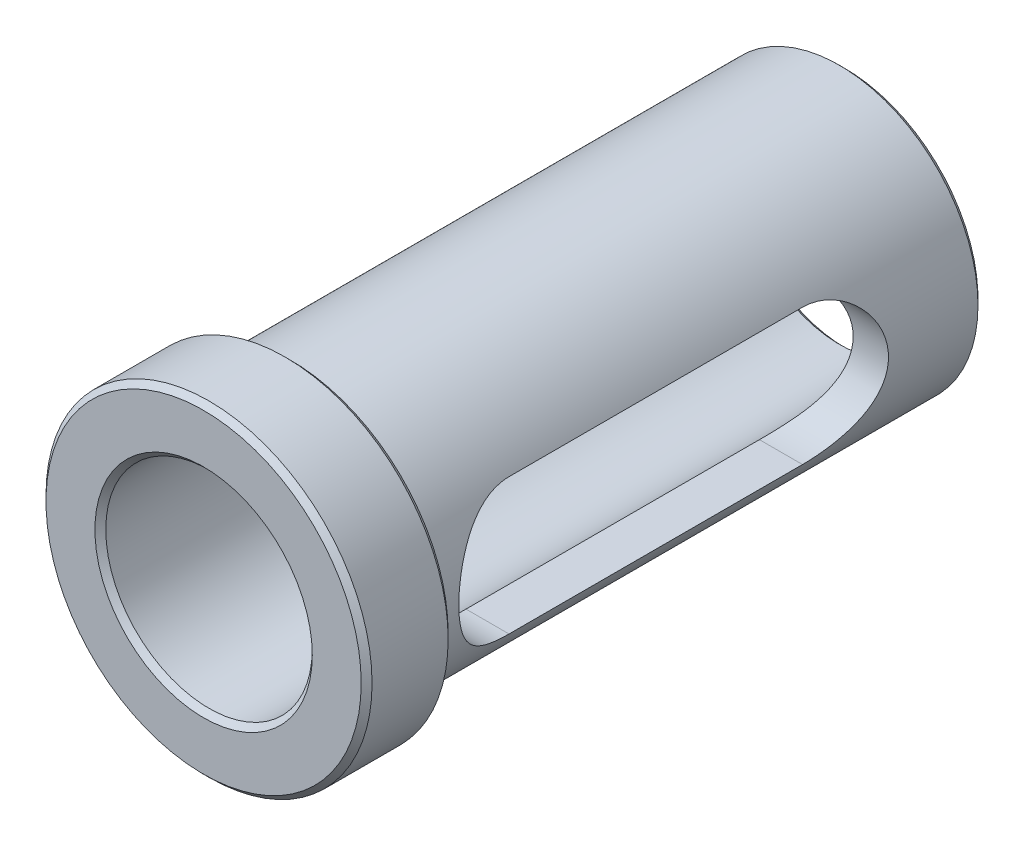
ISO-10303-21;
HEADER;
FILE_DESCRIPTION(('STEP AP214'),'2;1');
FILE_NAME('part.step','',(''),(''),'','','');
FILE_SCHEMA(('AUTOMOTIVE_DESIGN { 1 0 10303 214 1 1 1 1 }'));
ENDSEC;
DATA;
#1=APPLICATION_CONTEXT('core data for automotive mechanical design processes');
#2=APPLICATION_PROTOCOL_DEFINITION('international standard','automotive_design',2000,#1);
#3=PRODUCT_CONTEXT('',#1,'mechanical');
#4=PRODUCT('Part','Part','',(#3));
#5=PRODUCT_RELATED_PRODUCT_CATEGORY('part','',(#4));
#6=PRODUCT_DEFINITION_FORMATION('','',#4);
#7=PRODUCT_DEFINITION_CONTEXT('part definition',#1,'design');
#8=PRODUCT_DEFINITION('design','',#6,#7);
#9=PRODUCT_DEFINITION_SHAPE('','',#8);
#10=(LENGTH_UNIT() NAMED_UNIT(*) SI_UNIT(.MILLI.,.METRE.));
#11=(NAMED_UNIT(*) PLANE_ANGLE_UNIT() SI_UNIT($,.RADIAN.));
#12=(NAMED_UNIT(*) SI_UNIT($,.STERADIAN.) SOLID_ANGLE_UNIT());
#13=UNCERTAINTY_MEASURE_WITH_UNIT(LENGTH_MEASURE(1.E-05),#10,'distance_accuracy_value','');
#14=(GEOMETRIC_REPRESENTATION_CONTEXT(3) GLOBAL_UNCERTAINTY_ASSIGNED_CONTEXT((#13)) GLOBAL_UNIT_ASSIGNED_CONTEXT((#10,
#11,#12)) REPRESENTATION_CONTEXT('',''));
#15=CARTESIAN_POINT('',(0.,0.,0.));
#16=DIRECTION('',(0.,0.,1.));
#17=DIRECTION('',(1.,0.,0.));
#18=AXIS2_PLACEMENT_3D('',#15,#16,#17);
#19=CARTESIAN_POINT('',(-60.,30.,59.));
#20=DIRECTION('',(0.,0.,1.));
#21=DIRECTION('',(1.,0.,0.));
#22=AXIS2_PLACEMENT_3D('',#19,#20,#21);
#23=PLANE('',#22);
#24=CARTESIAN_POINT('',(-30.,0.,59.));
#25=DIRECTION('',(0.,0.,1.));
#26=DIRECTION('',(1.,0.,0.));
#27=AXIS2_PLACEMENT_3D('',#24,#25,#26);
#28=CIRCLE('',#27,29.);
#29=CARTESIAN_POINT('',(-1.,0.,59.));
#30=VERTEX_POINT('',#29);
#31=EDGE_CURVE('E84',#30,#30,#28,.T.);
#32=ORIENTED_EDGE('',*,*,#31,.T.);
#33=EDGE_LOOP('',(#32));
#34=FACE_BOUND('',#33,.T.);
#35=CARTESIAN_POINT('',(-30.,0.,59.));
#36=DIRECTION('',(0.,0.,1.));
#37=DIRECTION('',(1.,0.,0.));
#38=AXIS2_PLACEMENT_3D('',#35,#36,#37);
#39=CIRCLE('',#38,20.);
#40=CARTESIAN_POINT('',(-10.,0.,59.));
#41=VERTEX_POINT('',#40);
#42=EDGE_CURVE('E255',#41,#41,#39,.F.);
#43=ORIENTED_EDGE('',*,*,#42,.T.);
#44=EDGE_LOOP('',(#43));
#45=FACE_BOUND('',#44,.T.);
#46=ADVANCED_FACE('F75',(#34,#45),#23,.T.);
#47=CARTESIAN_POINT('',(0.,0.,43.));
#48=DIRECTION('',(0.,0.,1.));
#49=DIRECTION('',(1.,0.,0.));
#50=AXIS2_PLACEMENT_3D('',#47,#48,#49);
#51=PLANE('',#50);
#52=CARTESIAN_POINT('',(-30.,0.,43.));
#53=DIRECTION('',(0.,0.,1.));
#54=DIRECTION('',(1.,0.,0.));
#55=AXIS2_PLACEMENT_3D('',#52,#53,#54);
#56=CIRCLE('',#55,29.);
#57=CARTESIAN_POINT('',(-1.00000000000003,0.,43.));
#58=VERTEX_POINT('',#57);
#59=EDGE_CURVE('E256',#58,#58,#56,.F.);
#60=ORIENTED_EDGE('',*,*,#59,.T.);
#61=EDGE_LOOP('',(#60));
#62=FACE_BOUND('',#61,.T.);
#63=CARTESIAN_POINT('',(-30.,0.,43.));
#64=DIRECTION('',(0.,0.,-1.));
#65=DIRECTION('',(-1.,0.,0.));
#66=AXIS2_PLACEMENT_3D('',#63,#64,#65);
#67=CIRCLE('',#66,25.5);
#68=CARTESIAN_POINT('',(-55.5,0.,43.));
#69=VERTEX_POINT('',#68);
#70=EDGE_CURVE('E131',#69,#69,#67,.T.);
#71=ORIENTED_EDGE('',*,*,#70,.F.);
#72=EDGE_LOOP('',(#71));
#73=FACE_BOUND('',#72,.T.);
#74=ADVANCED_FACE('F191',(#62,#73),#51,.F.);
#75=CARTESIAN_POINT('',(-30.,0.,43.));
#76=DIRECTION('',(0.,0.,-1.));
#77=DIRECTION('',(-1.,0.,0.));
#78=AXIS2_PLACEMENT_3D('',#75,#76,#77);
#79=CYLINDRICAL_SURFACE('',#78,25.5);
#80=CARTESIAN_POINT('',(-30.,0.,-58.));
#81=DIRECTION('',(0.,0.,-1.));
#82=DIRECTION('',(-1.,0.,0.));
#83=AXIS2_PLACEMENT_3D('',#80,#81,#82);
#84=CIRCLE('',#83,25.5);
#85=CARTESIAN_POINT('',(-55.5,0.,-58.));
#86=VERTEX_POINT('',#85);
#87=EDGE_CURVE('E267',#86,#86,#84,.F.);
#88=ORIENTED_EDGE('',*,*,#87,.T.);
#89=EDGE_LOOP('',(#88));
#90=FACE_BOUND('',#89,.T.);
#91=ORIENTED_EDGE('',*,*,#70,.T.);
#92=EDGE_LOOP('',(#91));
#93=FACE_BOUND('',#92,.T.);
#94=CARTESIAN_POINT('',(-7.79306287389968,12.5340314136126,-29.));
#95=CARTESIAN_POINT('',(-7.79306652545145,12.534032584199,-29.1645527371761));
#96=CARTESIAN_POINT('',(-7.79123311705935,12.5307902200339,-29.3290823653121));
#97=CARTESIAN_POINT('',(-7.78392966300405,12.5178392432237,-29.6577995536914));
#98=CARTESIAN_POINT('',(-7.77845976488152,12.5081308929184,-29.8219871275416));
#99=CARTESIAN_POINT('',(-7.75666332184563,12.469359027442,-30.3133427365442));
#100=CARTESIAN_POINT('',(-7.73494990598311,12.4306486226182,-30.6395760527475));
#101=CARTESIAN_POINT('',(-7.67811970129288,12.3283020550073,-31.284979706198));
#102=CARTESIAN_POINT('',(-7.64307813610044,12.2648057311958,-31.6041792360231));
#103=CARTESIAN_POINT('',(-7.56081797273052,12.1136494364806,-32.2352297708415));
#104=CARTESIAN_POINT('',(-7.51359804339331,12.0259868240013,-32.5470799684445));
#105=CARTESIAN_POINT('',(-7.40865225416722,11.827660316394,-33.1607921363425));
#106=CARTESIAN_POINT('',(-7.35094855679309,11.7170448743736,-33.4626736189136));
#107=CARTESIAN_POINT('',(-7.22672427638553,11.4737333521897,-34.0554973795504));
#108=CARTESIAN_POINT('',(-7.16020379689223,11.341037531323,-34.346439786028));
#109=CARTESIAN_POINT('',(-7.02011702173395,11.0544307541191,-34.9163651202726));
#110=CARTESIAN_POINT('',(-6.94654212299853,10.9004937905381,-35.1953328289028));
#111=CARTESIAN_POINT('',(-6.79428746304174,10.5724927883026,-35.7398371087399));
#112=CARTESIAN_POINT('',(-6.71560582830033,10.3984213443365,-36.0053686862944));
#113=CARTESIAN_POINT('',(-6.5487212394416,10.0166986065193,-36.5421834481331));
#114=CARTESIAN_POINT('',(-6.46025637200227,9.8074825401531,-36.8122735959822));
#115=CARTESIAN_POINT('',(-6.28191992756092,9.36797310242462,-37.334232986258));
#116=CARTESIAN_POINT('',(-6.19204828084334,9.13767868372659,-37.5861013221695));
#117=CARTESIAN_POINT('',(-6.01310615228207,8.65706034895145,-38.0704848904219));
#118=CARTESIAN_POINT('',(-5.92403602234277,8.40672807102496,-38.3029919598095));
#119=CARTESIAN_POINT('',(-5.74893566361122,7.88739155364787,-38.7471901804871));
#120=CARTESIAN_POINT('',(-5.66290442058673,7.6183936344533,-38.9588883196505));
#121=CARTESIAN_POINT('',(-5.4904959916685,7.04482773820211,-39.3733080100405));
#122=CARTESIAN_POINT('',(-5.4044605086628,6.73908418558674,-39.5745492773418));
#123=CARTESIAN_POINT('',(-5.24056082045561,6.10949863103787,-39.9503593987374));
#124=CARTESIAN_POINT('',(-5.16269706729838,5.78565562939498,-40.1249267775271));
#125=CARTESIAN_POINT('',(-5.01741719504334,5.12209322769465,-40.4456024325304));
#126=CARTESIAN_POINT('',(-4.94999623444972,4.78238128046932,-40.5917239049775));
#127=CARTESIAN_POINT('',(-4.82758325896988,4.08939861262998,-40.8539429749819));
#128=CARTESIAN_POINT('',(-4.77258997446635,3.73612928136222,-40.970043639654));
#129=CARTESIAN_POINT('',(-4.68005925030353,3.04369018841511,-41.1638015377708));
#130=CARTESIAN_POINT('',(-4.64157774900044,2.70523451016146,-41.2435618655955));
#131=CARTESIAN_POINT('',(-4.57794745262472,2.02164387357694,-41.3748132769102));
#132=CARTESIAN_POINT('',(-4.55279809454517,1.67650919793345,-41.4263055541431));
#133=CARTESIAN_POINT('',(-4.51657005913149,0.982577078276234,-41.5003274740773));
#134=CARTESIAN_POINT('',(-4.50548471343279,0.633781449239939,-41.5228708427864));
#135=CARTESIAN_POINT('',(-4.49769124976309,-0.064625791821626,-41.5387299789822));
#136=CARTESIAN_POINT('',(-4.50098229075697,-0.414237354917912,-41.5320474562171));
#137=CARTESIAN_POINT('',(-4.52095836926321,-1.0818638054837,-41.4913478834201));
#138=CARTESIAN_POINT('',(-4.53649193377758,-1.40005979652988,-41.4596805244481));
#139=CARTESIAN_POINT('',(-4.57914153963131,-2.03232176579832,-41.3722853808483));
#140=CARTESIAN_POINT('',(-4.60625679367615,-2.34638802325403,-41.3165592316745));
#141=CARTESIAN_POINT('',(-4.67141720889816,-2.96827522471234,-41.1816474063877));
#142=CARTESIAN_POINT('',(-4.7094625156131,-3.2760960854967,-41.1024614178976));
#143=CARTESIAN_POINT('',(-4.79559324754165,-3.88355519923937,-40.921426015059));
#144=CARTESIAN_POINT('',(-4.84367902708191,-4.18319316300249,-40.8195758008854));
#145=CARTESIAN_POINT('',(-4.94954612938652,-4.77670515449438,-40.5925581474634));
#146=CARTESIAN_POINT('',(-5.00745467098394,-5.07043821762701,-40.4670820086296));
#147=CARTESIAN_POINT('',(-5.13118367147986,-5.64611970254987,-40.1948499534351));
#148=CARTESIAN_POINT('',(-5.19700412671481,-5.92806812979682,-40.0480940469277));
#149=CARTESIAN_POINT('',(-5.33514482386968,-6.47885383582023,-39.7343773751037));
#150=CARTESIAN_POINT('',(-5.40746580151042,-6.74768962519995,-39.5674143220253));
#151=CARTESIAN_POINT('',(-5.55711203576426,-7.27113248459325,-39.2143180549375));
#152=CARTESIAN_POINT('',(-5.63443923247849,-7.52573396617284,-39.0281773921447));
#153=CARTESIAN_POINT('',(-5.79975259322485,-8.04227305987944,-38.6198700304624));
#154=CARTESIAN_POINT('',(-5.88806514203287,-8.3027334990773,-38.3959645599695));
#155=CARTESIAN_POINT('',(-6.06657517269822,-8.80409007274224,-37.9279095171497));
#156=CARTESIAN_POINT('',(-6.15677275527023,-9.04498515848294,-37.6837588610721));
#157=CARTESIAN_POINT('',(-6.33687652400155,-9.50620459411686,-37.1762865934808));
#158=CARTESIAN_POINT('',(-6.42678244655028,-9.72651365949036,-36.9129509918441));
#159=CARTESIAN_POINT('',(-6.60392745143482,-10.1452197153638,-36.3684752044704));
#160=CARTESIAN_POINT('',(-6.69116605652291,-10.3436128009657,-36.0873318598193));
#161=CARTESIAN_POINT('',(-6.86572673670706,-10.7285951874088,-35.4909692622591));
#162=CARTESIAN_POINT('',(-6.95273143665345,-10.9137335654738,-35.1747174794473));
#163=CARTESIAN_POINT('',(-7.11809669997008,-11.2563176736091,-34.5255646544825));
#164=CARTESIAN_POINT('',(-7.19646126560637,-11.4137762457269,-34.1926714256937));
#165=CARTESIAN_POINT('',(-7.34160518909062,-11.6992633278632,-33.5127485020496));
#166=CARTESIAN_POINT('',(-7.40840446282533,-11.8273425564006,-33.165744405593));
#167=CARTESIAN_POINT('',(-7.52788133393109,-12.0528094991958,-32.4596153772653));
#168=CARTESIAN_POINT('',(-7.58056507710046,-12.15021057375,-32.1004957973198));
#169=CARTESIAN_POINT('',(-7.65235325284447,-12.2815258091118,-31.5136522393541));
#170=CARTESIAN_POINT('',(-7.67656881661122,-12.325432201615,-31.2887337037));
#171=CARTESIAN_POINT('',(-7.71841026964344,-12.4009122367867,-30.836271100813));
#172=CARTESIAN_POINT('',(-7.7360379807534,-12.4324892891936,-30.6087277774254));
#173=CARTESIAN_POINT('',(-7.76439949672921,-12.483147075153,-30.1514965827909));
#174=CARTESIAN_POINT('',(-7.77512337446403,-12.5022098149507,-29.921806103094));
#175=CARTESIAN_POINT('',(-7.78946818104978,-12.527661864415,-29.4614139478222));
#176=CARTESIAN_POINT('',(-7.79308632596481,-12.5340462068574,-29.2307119113954));
#177=CARTESIAN_POINT('',(-7.79306287389967,-12.5340314136126,-29.));
#178=B_SPLINE_CURVE_WITH_KNOTS('',3,(#94,#95,#96,#97,#98,#99,#100,#101,#102,#103,#104,#105,#106,
#107,#108,#109,#110,#111,#112,#113,#114,#115,#116,#117,#118,#119,#120,#121,#122,#123,#124,#125,
#126,#127,#128,#129,#130,#131,#132,#133,#134,#135,#136,#137,#138,#139,#140,#141,#142,#143,#144,
#145,#146,#147,#148,#149,#150,#151,#152,#153,#154,#155,#156,#157,#158,#159,#160,#161,#162,#163,
#164,#165,#166,#167,#168,#169,#170,#171,#172,#173,#174,#175,#176,#177),.UNSPECIFIED.,.F.,.F.,(4,
2,2,2,2,2,2,2,2,2,2,2,2,2,2,2,2,2,2,2,2,2,2,2,2,2,2,2,2,2,2,2,2,2,2,2,2,2,2,2,2,4),(0.,
0.493570394972162,0.987120765891671,1.97340733114684,2.95420800051853,3.93511592207003,
4.91397385067768,5.89282028505755,6.87287601385546,7.85329335290784,8.91089857051257,
9.96855636668999,11.0266578504458,12.0844027891018,13.2109701295057,14.3375997566191,
15.4637054811858,16.5896961101959,17.6378299055364,18.6859194354051,19.7335118341521,
20.7810429483619,21.7403444411177,22.6995807333145,23.6588297986966,24.6181127215437,
25.5909297709052,26.5637463698117,27.5366732098287,28.509979379691,29.5727594773523,
30.6355965037572,31.6992164875796,32.7630256781504,33.8915104656504,35.0194703027842,
36.1454680001352,37.2709746467386,37.9619063956473,38.6526469284848,39.3443784826285,
40.0363809943893),.UNSPECIFIED.);
#179=CARTESIAN_POINT('',(-7.79306287389968,12.5340314136126,-29.));
#180=VERTEX_POINT('',#179);
#181=CARTESIAN_POINT('',(-7.79306287389969,-12.5340314136126,-29.));
#182=VERTEX_POINT('',#181);
#183=EDGE_CURVE('E137',#180,#182,#178,.T.);
#184=ORIENTED_EDGE('',*,*,#183,.T.);
#185=DIRECTION('',(0.,0.,-1.));
#186=VECTOR('',#185,1.);
#187=CARTESIAN_POINT('',(-7.79306287389969,-12.5340314136126,43.));
#188=LINE('',#187,#186);
#189=CARTESIAN_POINT('',(-7.79306287389968,-12.5340314136126,25.));
#190=VERTEX_POINT('',#189);
#191=EDGE_CURVE('E141',#182,#190,#188,.F.);
#192=ORIENTED_EDGE('',*,*,#191,.T.);
#193=CARTESIAN_POINT('',(-7.79306287389968,-12.5340314136126,25.));
#194=CARTESIAN_POINT('',(-7.79306652545144,-12.534032584199,25.1645527371761));
#195=CARTESIAN_POINT('',(-7.79123311705934,-12.5307902200339,25.3290823653121));
#196=CARTESIAN_POINT('',(-7.78392966300404,-12.5178392432237,25.6577995536914));
#197=CARTESIAN_POINT('',(-7.77845976488151,-12.5081308929184,25.8219871275416));
#198=CARTESIAN_POINT('',(-7.75666332184563,-12.4693590274419,26.3133427365442));
#199=CARTESIAN_POINT('',(-7.7349499059831,-12.4306486226182,26.6395760527475));
#200=CARTESIAN_POINT('',(-7.67811970129287,-12.3283020550073,27.284979706198));
#201=CARTESIAN_POINT('',(-7.64307813610044,-12.2648057311958,27.6041792360231));
#202=CARTESIAN_POINT('',(-7.56081797273052,-12.1136494364806,28.2352297708415));
#203=CARTESIAN_POINT('',(-7.51359804339331,-12.0259868240013,28.5470799684445));
#204=CARTESIAN_POINT('',(-7.40865225416722,-11.827660316394,29.1607921363425));
#205=CARTESIAN_POINT('',(-7.35094855679309,-11.7170448743736,29.4626736189136));
#206=CARTESIAN_POINT('',(-7.22672427638553,-11.4737333521897,30.0554973795504));
#207=CARTESIAN_POINT('',(-7.16020379689223,-11.341037531323,30.346439786028));
#208=CARTESIAN_POINT('',(-7.02011702173394,-11.0544307541191,30.9163651202726));
#209=CARTESIAN_POINT('',(-6.94654212299853,-10.9004937905381,31.1953328289028));
#210=CARTESIAN_POINT('',(-6.79428746304173,-10.5724927883025,31.7398371087399));
#211=CARTESIAN_POINT('',(-6.71560582830033,-10.3984213443364,32.0053686862944));
#212=CARTESIAN_POINT('',(-6.5487212394416,-10.0166986065193,32.5421834481331));
#213=CARTESIAN_POINT('',(-6.46025637200227,-9.80748254015309,32.8122735959822));
#214=CARTESIAN_POINT('',(-6.28191992756092,-9.36797310242461,33.334232986258));
#215=CARTESIAN_POINT('',(-6.19204828084334,-9.13767868372658,33.5861013221695));
#216=CARTESIAN_POINT('',(-6.01310615228206,-8.65706034895143,34.0704848904219));
#217=CARTESIAN_POINT('',(-5.92403602234277,-8.40672807102495,34.3029919598095));
#218=CARTESIAN_POINT('',(-5.74893566361122,-7.88739155364786,34.7471901804871));
#219=CARTESIAN_POINT('',(-5.66290442058673,-7.61839363445328,34.9588883196505));
#220=CARTESIAN_POINT('',(-5.4904959916685,-7.04482773820209,35.3733080100405));
#221=CARTESIAN_POINT('',(-5.4044605086628,-6.73908418558672,35.5745492773418));
#222=CARTESIAN_POINT('',(-5.24056082045561,-6.10949863103786,35.9503593987374));
#223=CARTESIAN_POINT('',(-5.16269706729837,-5.78565562939496,36.1249267775271));
#224=CARTESIAN_POINT('',(-5.01741719504333,-5.12209322769464,36.4456024325304));
#225=CARTESIAN_POINT('',(-4.94999623444972,-4.78238128046931,36.5917239049775));
#226=CARTESIAN_POINT('',(-4.82758325896988,-4.08939861262996,36.8539429749819));
#227=CARTESIAN_POINT('',(-4.77258997446635,-3.73612928136221,36.970043639654));
#228=CARTESIAN_POINT('',(-4.68005925030353,-3.04369018841509,37.1638015377708));
#229=CARTESIAN_POINT('',(-4.64157774900043,-2.70523451016145,37.2435618655955));
#230=CARTESIAN_POINT('',(-4.57794745262472,-2.02164387357693,37.3748132769102));
#231=CARTESIAN_POINT('',(-4.55279809454516,-1.67650919793344,37.4263055541431));
#232=CARTESIAN_POINT('',(-4.51657005913148,-0.982577078276223,37.5003274740773));
#233=CARTESIAN_POINT('',(-4.50548471343279,-0.633781449239928,37.5228708427864));
#234=CARTESIAN_POINT('',(-4.49769124976309,0.0646257918216375,37.5387299789822));
#235=CARTESIAN_POINT('',(-4.50098229075697,0.414237354917925,37.5320474562171));
#236=CARTESIAN_POINT('',(-4.52095836926321,1.08186380548371,37.4913478834201));
#237=CARTESIAN_POINT('',(-4.53649193377758,1.4000597965299,37.4596805244481));
#238=CARTESIAN_POINT('',(-4.57914153963131,2.03232176579834,37.3722853808483));
#239=CARTESIAN_POINT('',(-4.60625679367615,2.34638802325405,37.3165592316745));
#240=CARTESIAN_POINT('',(-4.67141720889816,2.96827522471236,37.1816474063877));
#241=CARTESIAN_POINT('',(-4.7094625156131,3.27609608549672,37.1024614178976));
#242=CARTESIAN_POINT('',(-4.79559324754166,3.88355519923938,36.921426015059));
#243=CARTESIAN_POINT('',(-4.84367902708191,4.18319316300251,36.8195758008854));
#244=CARTESIAN_POINT('',(-4.94954612938653,4.7767051544944,36.5925581474634));
#245=CARTESIAN_POINT('',(-5.00745467098394,5.07043821762703,36.4670820086296));
#246=CARTESIAN_POINT('',(-5.13118367147986,5.64611970254989,36.194849953435));
#247=CARTESIAN_POINT('',(-5.19700412671481,5.92806812979684,36.0480940469277));
#248=CARTESIAN_POINT('',(-5.33514482386968,6.47885383582024,35.7343773751037));
#249=CARTESIAN_POINT('',(-5.40746580151042,6.74768962519997,35.5674143220253));
#250=CARTESIAN_POINT('',(-5.55711203576427,7.27113248459327,35.2143180549375));
#251=CARTESIAN_POINT('',(-5.63443923247849,7.52573396617285,35.0281773921447));
#252=CARTESIAN_POINT('',(-5.79975259322486,8.04227305987945,34.6198700304624));
#253=CARTESIAN_POINT('',(-5.88806514203288,8.30273349907731,34.3959645599695));
#254=CARTESIAN_POINT('',(-6.06657517269822,8.80409007274226,33.9279095171497));
#255=CARTESIAN_POINT('',(-6.15677275527023,9.04498515848296,33.6837588610721));
#256=CARTESIAN_POINT('',(-6.33687652400156,9.50620459411688,33.1762865934808));
#257=CARTESIAN_POINT('',(-6.42678244655029,9.72651365949038,32.9129509918441));
#258=CARTESIAN_POINT('',(-6.60392745143483,10.1452197153638,32.3684752044704));
#259=CARTESIAN_POINT('',(-6.69116605652292,10.3436128009657,32.0873318598193));
#260=CARTESIAN_POINT('',(-6.86572673670707,10.7285951874088,31.4909692622591));
#261=CARTESIAN_POINT('',(-6.95273143665347,10.9137335654738,31.1747174794473));
#262=CARTESIAN_POINT('',(-7.11809669997009,11.2563176736091,30.5255646544825));
#263=CARTESIAN_POINT('',(-7.19646126560638,11.4137762457269,30.1926714256937));
#264=CARTESIAN_POINT('',(-7.34160518909063,11.6992633278632,29.5127485020496));
#265=CARTESIAN_POINT('',(-7.40840446282535,11.8273425564006,29.1657444055929));
#266=CARTESIAN_POINT('',(-7.52788133393111,12.0528094991958,28.4596153772653));
#267=CARTESIAN_POINT('',(-7.58056507710047,12.1502105737501,28.1004957973198));
#268=CARTESIAN_POINT('',(-7.65235325284449,12.2815258091118,27.5136522393541));
#269=CARTESIAN_POINT('',(-7.67656881661124,12.325432201615,27.2887337037));
#270=CARTESIAN_POINT('',(-7.71841026964346,12.4009122367867,26.836271100813));
#271=CARTESIAN_POINT('',(-7.73603798075341,12.4324892891936,26.6087277774254));
#272=CARTESIAN_POINT('',(-7.76439949672922,12.483147075153,26.1514965827909));
#273=CARTESIAN_POINT('',(-7.77512337446404,12.5022098149508,25.9218061030939));
#274=CARTESIAN_POINT('',(-7.78946818104979,12.527661864415,25.4614139478222));
#275=CARTESIAN_POINT('',(-7.79308632596482,12.5340462068574,25.2307119113954));
#276=CARTESIAN_POINT('',(-7.79306287389969,12.5340314136126,25.));
#277=B_SPLINE_CURVE_WITH_KNOTS('',3,(#193,#194,#195,#196,#197,#198,#199,#200,#201,#202,#203,
#204,#205,#206,#207,#208,#209,#210,#211,#212,#213,#214,#215,#216,#217,#218,#219,#220,#221,#222,
#223,#224,#225,#226,#227,#228,#229,#230,#231,#232,#233,#234,#235,#236,#237,#238,#239,#240,#241,
#242,#243,#244,#245,#246,#247,#248,#249,#250,#251,#252,#253,#254,#255,#256,#257,#258,#259,#260,
#261,#262,#263,#264,#265,#266,#267,#268,#269,#270,#271,#272,#273,#274,#275,#276),.UNSPECIFIED.,
.F.,.F.,(4,2,2,2,2,2,2,2,2,2,2,2,2,2,2,2,2,2,2,2,2,2,2,2,2,2,2,2,2,2,2,2,2,2,2,2,2,2,2,2,2,4),
(0.,0.493570394972155,0.987120765891668,1.97340733114684,2.95420800051853,3.93511592207003,
4.91397385067768,5.89282028505756,6.87287601385547,7.85329335290785,8.91089857051258,
9.96855636668999,11.0266578504458,12.0844027891018,13.2109701295057,14.3375997566191,
15.4637054811858,16.5896961101959,17.6378299055364,18.6859194354051,19.7335118341521,
20.7810429483619,21.7403444411177,22.6995807333145,23.6588297986966,24.6181127215437,
25.5909297709052,26.5637463698117,27.5366732098287,28.509979379691,29.5727594773523,
30.6355965037572,31.6992164875796,32.7630256781504,33.8915104656504,35.0194703027842,
36.1454680001352,37.2709746467386,37.9619063956473,38.6526469284848,39.3443784826285,
40.0363809943893),.UNSPECIFIED.);
#278=CARTESIAN_POINT('',(-7.79306287389968,12.5340314136126,25.));
#279=VERTEX_POINT('',#278);
#280=EDGE_CURVE('E181',#190,#279,#277,.T.);
#281=ORIENTED_EDGE('',*,*,#280,.T.);
#282=DIRECTION('',(0.,0.,-1.));
#283=VECTOR('',#282,1.);
#284=CARTESIAN_POINT('',(-7.79306287389968,12.5340314136126,43.));
#285=LINE('',#284,#283);
#286=EDGE_CURVE('E124',#279,#180,#285,.T.);
#287=ORIENTED_EDGE('',*,*,#286,.T.);
#288=EDGE_LOOP('',(#184,#192,#281,#287));
#289=FACE_BOUND('',#288,.T.);
#290=ADVANCED_FACE('F187',(#90,#93,#289),#79,.T.);
#291=CARTESIAN_POINT('',(-60.,30.,-59.));
#292=DIRECTION('',(0.,0.,-1.));
#293=DIRECTION('',(-1.,0.,0.));
#294=AXIS2_PLACEMENT_3D('',#291,#292,#293);
#295=PLANE('',#294);
#296=CARTESIAN_POINT('',(-30.,0.,-59.));
#297=DIRECTION('',(0.,0.,-1.));
#298=DIRECTION('',(-1.,0.,0.));
#299=AXIS2_PLACEMENT_3D('',#296,#297,#298);
#300=CIRCLE('',#299,24.5);
#301=CARTESIAN_POINT('',(-54.5,0.,-59.));
#302=VERTEX_POINT('',#301);
#303=EDGE_CURVE('E270',#302,#302,#300,.T.);
#304=ORIENTED_EDGE('',*,*,#303,.T.);
#305=EDGE_LOOP('',(#304));
#306=FACE_BOUND('',#305,.T.);
#307=CARTESIAN_POINT('',(-30.,0.,-59.));
#308=DIRECTION('',(0.,0.,-1.));
#309=DIRECTION('',(-1.,0.,0.));
#310=AXIS2_PLACEMENT_3D('',#307,#308,#309);
#311=CIRCLE('',#310,20.);
#312=CARTESIAN_POINT('',(-50.,0.,-59.));
#313=VERTEX_POINT('',#312);
#314=EDGE_CURVE('E272',#313,#313,#311,.F.);
#315=ORIENTED_EDGE('',*,*,#314,.T.);
#316=EDGE_LOOP('',(#315));
#317=FACE_BOUND('',#316,.T.);
#318=ADVANCED_FACE('F190',(#306,#317),#295,.T.);
#319=CARTESIAN_POINT('',(-30.,12.5340314136126,-29.));
#320=DIRECTION('',(0.,1.,0.));
#321=DIRECTION('',(0.,0.,1.));
#322=AXIS2_PLACEMENT_3D('',#319,#320,#321);
#323=PLANE('',#322);
#324=DIRECTION('',(1.,0.,0.));
#325=VECTOR('',#324,1.);
#326=CARTESIAN_POINT('',(-30.,12.5340314136126,25.));
#327=LINE('',#326,#325);
#328=CARTESIAN_POINT('',(-15.7207123243989,12.5340314136126,25.));
#329=VERTEX_POINT('',#328);
#330=EDGE_CURVE('E99',#329,#279,#327,.T.);
#331=ORIENTED_EDGE('',*,*,#330,.F.);
#332=DIRECTION('',(0.,0.,-1.));
#333=VECTOR('',#332,1.);
#334=CARTESIAN_POINT('',(-15.7207123243989,12.5340314136126,59.));
#335=LINE('',#334,#333);
#336=CARTESIAN_POINT('',(-15.7207123243989,12.5340314136126,-29.));
#337=VERTEX_POINT('',#336);
#338=EDGE_CURVE('E119',#329,#337,#335,.T.);
#339=ORIENTED_EDGE('',*,*,#338,.T.);
#340=DIRECTION('',(1.,0.,0.));
#341=VECTOR('',#340,1.);
#342=CARTESIAN_POINT('',(-30.,12.5340314136126,-29.));
#343=LINE('',#342,#341);
#344=EDGE_CURVE('E129',#337,#180,#343,.T.);
#345=ORIENTED_EDGE('',*,*,#344,.T.);
#346=ORIENTED_EDGE('',*,*,#286,.F.);
#347=EDGE_LOOP('',(#331,#339,#345,#346));
#348=FACE_BOUND('',#347,.T.);
#349=ADVANCED_FACE('F127',(#348),#323,.F.);
#350=CARTESIAN_POINT('',(-30.,0.,25.));
#351=DIRECTION('',(1.,0.,0.));
#352=DIRECTION('',(0.,0.,-1.));
#353=AXIS2_PLACEMENT_3D('',#350,#351,#352);
#354=CYLINDRICAL_SURFACE('',#353,12.5340314136126);
#355=DIRECTION('',(1.,0.,0.));
#356=VECTOR('',#355,1.);
#357=CARTESIAN_POINT('',(-30.,-12.5340314136126,25.));
#358=LINE('',#357,#356);
#359=CARTESIAN_POINT('',(-15.7207123243989,-12.5340314136126,25.));
#360=VERTEX_POINT('',#359);
#361=EDGE_CURVE('E139',#360,#190,#358,.T.);
#362=ORIENTED_EDGE('',*,*,#361,.F.);
#363=CARTESIAN_POINT('',(-15.7207123243989,-12.5340314136126,25.));
#364=CARTESIAN_POINT('',(-15.7207193292792,-12.5340338123681,25.1545452335319));
#365=CARTESIAN_POINT('',(-15.7182020910199,-12.531172286834,25.3090646762266));
#366=CARTESIAN_POINT('',(-15.7081885803444,-12.5197528448059,25.6177168297775));
#367=CARTESIAN_POINT('',(-15.7006927867036,-12.511195476067,25.7718495763906));
#368=CARTESIAN_POINT('',(-15.6708717650174,-12.4770611733041,26.2327342052203));
#369=CARTESIAN_POINT('',(-15.6412124664612,-12.4430218302618,26.5384523061174));
#370=CARTESIAN_POINT('',(-15.5641222132373,-12.3534950693473,27.1412937191652));
#371=CARTESIAN_POINT('',(-15.5168656226305,-12.298217922514,27.4384715172987));
#372=CARTESIAN_POINT('',(-15.4065901554318,-12.1671571226992,28.025336478789));
#373=CARTESIAN_POINT('',(-15.3435668718284,-12.0913677357736,28.3150215227947));
#374=CARTESIAN_POINT('',(-15.2045130317787,-11.9208042468806,28.8838237168975));
#375=CARTESIAN_POINT('',(-15.1285498752279,-11.8261281038618,29.1629869064715));
#376=CARTESIAN_POINT('',(-14.9658930182742,-11.618650721453,29.7111395146342));
#377=CARTESIAN_POINT('',(-14.8791998350869,-11.50585035562,29.9801294227864));
#378=CARTESIAN_POINT('',(-14.6061480167139,-11.1409783983015,30.7722553091786));
#379=CARTESIAN_POINT('',(-14.4071257289351,-10.862797542037,31.2793603668485));
#380=CARTESIAN_POINT('',(-14.0813879049088,-10.375159374898,32.040398740805));
#381=CARTESIAN_POINT('',(-13.9598215106171,-10.1866216492776,32.3104606254925));
#382=CARTESIAN_POINT('',(-13.7143629216921,-9.78940517981006,32.8343776378409));
#383=CARTESIAN_POINT('',(-13.5904705751007,-9.58072511631747,33.0882317018174));
#384=CARTESIAN_POINT('',(-13.3431097804449,-9.14390817578123,33.5789780832761));
#385=CARTESIAN_POINT('',(-13.2196414946587,-8.91576456221599,33.8158644754724));
#386=CARTESIAN_POINT('',(-12.9757248210125,-8.44069652494617,34.2717288536147));
#387=CARTESIAN_POINT('',(-12.8552766345151,-8.19377085336817,34.4907056476438));
#388=CARTESIAN_POINT('',(-12.6032805062009,-7.64574586156777,34.9391592030872));
#389=CARTESIAN_POINT('',(-12.4725565407275,-7.34191341783421,35.1657755110598));
#390=CARTESIAN_POINT('',(-12.2217529603573,-6.71184829904782,35.5923447196333));
#391=CARTESIAN_POINT('',(-12.1016745988261,-6.3856129943855,35.792294482029));
#392=CARTESIAN_POINT('',(-11.8756638221082,-5.71264526485608,36.1631130785155));
#393=CARTESIAN_POINT('',(-11.7697210719708,-5.36592808544099,36.3340031843245));
#394=CARTESIAN_POINT('',(-11.5751358813615,-4.65407631915751,36.6444059354818));
#395=CARTESIAN_POINT('',(-11.4864898326058,-4.28894559360309,36.7839251260786));
#396=CARTESIAN_POINT('',(-11.3381006159375,-3.58447067113923,37.0156328884769));
#397=CARTESIAN_POINT('',(-11.2762471245218,-3.24672919443283,37.1113460617347));
#398=CARTESIAN_POINT('',(-11.1703012161618,-2.5617360485858,37.2745003545134));
#399=CARTESIAN_POINT('',(-11.1262076181692,-2.21448501347977,37.3419433540375));
#400=CARTESIAN_POINT('',(-11.0571512705755,-1.5140073339854,37.4472905761944));
#401=CARTESIAN_POINT('',(-11.0321689716701,-1.16078717468952,37.4852249843869));
#402=CARTESIAN_POINT('',(-11.0020531659617,-0.451574857205864,37.5309310472963));
#403=CARTESIAN_POINT('',(-10.996916952138,-0.0955830837063228,37.5387068156745));
#404=CARTESIAN_POINT('',(-11.0059136087727,0.562378204342709,37.5250652201166));
#405=CARTESIAN_POINT('',(-11.0172859872112,0.86448358825504,37.5078301962052));
#406=CARTESIAN_POINT('',(-11.0542295386698,1.46576650654888,37.4516912016874));
#407=CARTESIAN_POINT('',(-11.0797989201388,1.7649444055095,37.4127899651858));
#408=CARTESIAN_POINT('',(-11.1445607595317,2.3582822934773,37.3138510422344));
#409=CARTESIAN_POINT('',(-11.1837537898062,2.65244207112065,37.2538124677709));
#410=CARTESIAN_POINT('',(-11.2749122393732,3.23383380522083,37.1133689494163));
#411=CARTESIAN_POINT('',(-11.3268782086932,3.52106546275433,37.0329631284675));
#412=CARTESIAN_POINT('',(-11.4423313872336,4.08605269089179,36.8530061439119));
#413=CARTESIAN_POINT('',(-11.5057825109156,4.36383479275918,36.7535148884451));
#414=CARTESIAN_POINT('',(-11.6431169033,4.90958882737261,36.5362122094224));
#415=CARTESIAN_POINT('',(-11.7170043672028,5.17755676020015,36.418393416623));
#416=CARTESIAN_POINT('',(-11.8738433123826,5.70240773092783,36.1655421703996));
#417=CARTESIAN_POINT('',(-11.9567932140601,5.95929268975688,36.0305127161437));
#418=CARTESIAN_POINT('',(-12.1303666705071,6.46117086230256,35.7442400738632));
#419=CARTESIAN_POINT('',(-12.2209911162448,6.7061626900901,35.5929950027597));
#420=CARTESIAN_POINT('',(-12.4206789807142,7.21467135935313,35.2545360314338));
#421=CARTESIAN_POINT('',(-12.5306061000609,7.47644017628631,35.0652034235084));
#422=CARTESIAN_POINT('',(-12.7562435191667,7.98309379614603,34.6682854537394));
#423=CARTESIAN_POINT('',(-12.8719542484167,8.22797734194926,34.4606987354735));
#424=CARTESIAN_POINT('',(-13.1070943495134,8.70054491531338,34.0280250792098));
#425=CARTESIAN_POINT('',(-13.2265286709526,8.92820454006439,33.8029141958415));
#426=CARTESIAN_POINT('',(-13.4666350367119,9.36536417129197,33.3363132579993));
#427=CARTESIAN_POINT('',(-13.5873071455084,9.57486322635565,33.0948223465732));
#428=CARTESIAN_POINT('',(-13.8455861516811,10.005351190039,32.5584621095457));
#429=CARTESIAN_POINT('',(-13.9829962512433,10.2232916285991,32.2610413914063));
#430=CARTESIAN_POINT('',(-14.2521541856565,10.6332261120067,31.64627472828));
#431=CARTESIAN_POINT('',(-14.3839007226588,10.8252142310698,31.3289242568077));
#432=CARTESIAN_POINT('',(-14.6370637197976,11.181588262002,30.6755923133574));
#433=CARTESIAN_POINT('',(-14.758490751962,11.346002594728,30.3396305057087));
#434=CARTESIAN_POINT('',(-14.9861618473422,11.645603561384,29.6500551952362));
#435=CARTESIAN_POINT('',(-15.0924135018488,11.7808048262639,29.2964506382754));
#436=CARTESIAN_POINT('',(-15.2579353462812,11.9868197163424,28.6734206803079));
#437=CARTESIAN_POINT('',(-15.3220742439631,12.0651014139332,28.4077393076147));
#438=CARTESIAN_POINT('',(-15.4376744116817,12.2043794486061,27.869208406247));
#439=CARTESIAN_POINT('',(-15.4891392760973,12.2653806871974,27.59636093424));
#440=CARTESIAN_POINT('',(-15.57747793832,12.3691349473705,27.0456659808488));
#441=CARTESIAN_POINT('',(-15.6143909210504,12.4119370000317,26.7678340628595));
#442=CARTESIAN_POINT('',(-15.6723690142144,12.4788212253271,26.208393244992));
#443=CARTESIAN_POINT('',(-15.6934442496727,12.5029153582066,25.9267868755298));
#444=CARTESIAN_POINT('',(-15.7110166060451,12.5229783232489,25.5371401118633));
#445=CARTESIAN_POINT('',(-15.7146506139646,12.5271228054646,25.4297634982623));
#446=CARTESIAN_POINT('',(-15.7194981884737,12.5326486491643,25.2149291107817));
#447=CARTESIAN_POINT('',(-15.7207127552745,12.5340311524674,25.1074713888202));
#448=CARTESIAN_POINT('',(-15.7207123243989,12.5340314136126,25.));
#449=B_SPLINE_CURVE_WITH_KNOTS('',3,(#363,#364,#365,#366,#367,#368,#369,#370,#371,#372,#373,
#374,#375,#376,#377,#378,#379,#380,#381,#382,#383,#384,#385,#386,#387,#388,#389,#390,#391,#392,
#393,#394,#395,#396,#397,#398,#399,#400,#401,#402,#403,#404,#405,#406,#407,#408,#409,#410,#411,
#412,#413,#414,#415,#416,#417,#418,#419,#420,#421,#422,#423,#424,#425,#426,#427,#428,#429,#430,
#431,#432,#433,#434,#435,#436,#437,#438,#439,#440,#441,#442,#443,#444,#445,#446,#447,#448),
.UNSPECIFIED.,.F.,.F.,(4,2,2,2,2,2,2,2,2,2,2,2,2,2,2,2,2,2,2,2,2,2,2,2,2,2,2,2,2,2,2,2,2,2,2,2,
2,2,2,2,2,2,4),(0.,0.463538353547521,0.927032136204066,1.85258644471186,2.76920382453922,
3.68607769857856,4.59831424215688,5.51050683064688,7.33869208285255,8.39120073236875,
9.44377838490729,10.4967218342494,11.5497353019977,12.7509659824723,13.9523379031556,
15.1528265962311,16.3530645856629,17.4208120344991,18.4884884654782,19.555071284528,
20.6215086157566,21.528840709268,22.4360583305706,23.3433140700993,24.2506088846622,
25.155101021637,26.0599577866703,26.9646570843829,27.8694615565802,28.8922087667027,
29.9150320392222,30.939278314005,31.9635782155698,33.1426788854692,34.3220483304358,
35.5001946034149,36.6777494438028,37.5298616294627,38.3817318755253,39.2312922975635,
40.0803091350312,40.4028137538433,40.7251850196437),.UNSPECIFIED.);
#450=EDGE_CURVE('E132',#360,#329,#449,.T.);
#451=ORIENTED_EDGE('',*,*,#450,.T.);
#452=ORIENTED_EDGE('',*,*,#330,.T.);
#453=ORIENTED_EDGE('',*,*,#280,.F.);
#454=EDGE_LOOP('',(#362,#451,#452,#453));
#455=FACE_BOUND('',#454,.T.);
#456=ADVANCED_FACE('F173',(#455),#354,.F.);
#457=CARTESIAN_POINT('',(-30.,-12.5340314136126,-29.));
#458=DIRECTION('',(0.,-1.,0.));
#459=DIRECTION('',(0.,0.,-1.));
#460=AXIS2_PLACEMENT_3D('',#457,#458,#459);
#461=PLANE('',#460);
#462=DIRECTION('',(1.,0.,0.));
#463=VECTOR('',#462,1.);
#464=CARTESIAN_POINT('',(-30.,-12.5340314136126,-29.));
#465=LINE('',#464,#463);
#466=CARTESIAN_POINT('',(-15.7207123243989,-12.5340314136126,-29.));
#467=VERTEX_POINT('',#466);
#468=EDGE_CURVE('E145',#467,#182,#465,.T.);
#469=ORIENTED_EDGE('',*,*,#468,.F.);
#470=DIRECTION('',(0.,0.,-1.));
#471=VECTOR('',#470,1.);
#472=CARTESIAN_POINT('',(-15.7207123243989,-12.5340314136126,59.));
#473=LINE('',#472,#471);
#474=EDGE_CURVE('E91',#467,#360,#473,.F.);
#475=ORIENTED_EDGE('',*,*,#474,.T.);
#476=ORIENTED_EDGE('',*,*,#361,.T.);
#477=ORIENTED_EDGE('',*,*,#191,.F.);
#478=EDGE_LOOP('',(#469,#475,#476,#477));
#479=FACE_BOUND('',#478,.T.);
#480=ADVANCED_FACE('F177',(#479),#461,.F.);
#481=CARTESIAN_POINT('',(-30.,0.,-29.));
#482=DIRECTION('',(1.,0.,0.));
#483=DIRECTION('',(0.,0.,-1.));
#484=AXIS2_PLACEMENT_3D('',#481,#482,#483);
#485=CYLINDRICAL_SURFACE('',#484,12.5340314136126);
#486=ORIENTED_EDGE('',*,*,#344,.F.);
#487=CARTESIAN_POINT('',(-15.7207123243989,12.5340314136126,-29.));
#488=CARTESIAN_POINT('',(-15.7207193292792,12.5340338123681,-29.1545452335319));
#489=CARTESIAN_POINT('',(-15.7182020910199,12.531172286834,-29.3090646762266));
#490=CARTESIAN_POINT('',(-15.7081885803444,12.5197528448059,-29.6177168297775));
#491=CARTESIAN_POINT('',(-15.7006927867036,12.511195476067,-29.7718495763906));
#492=CARTESIAN_POINT('',(-15.6708717650174,12.4770611733041,-30.2327342052203));
#493=CARTESIAN_POINT('',(-15.6412124664612,12.4430218302618,-30.5384523061174));
#494=CARTESIAN_POINT('',(-15.5641222132373,12.3534950693473,-31.1412937191652));
#495=CARTESIAN_POINT('',(-15.5168656226305,12.298217922514,-31.4384715172987));
#496=CARTESIAN_POINT('',(-15.4065901554319,12.1671571226992,-32.025336478789));
#497=CARTESIAN_POINT('',(-15.3435668718284,12.0913677357737,-32.3150215227947));
#498=CARTESIAN_POINT('',(-15.2045130317787,11.9208042468806,-32.8838237168975));
#499=CARTESIAN_POINT('',(-15.1285498752279,11.8261281038618,-33.1629869064715));
#500=CARTESIAN_POINT('',(-14.9658930182742,11.618650721453,-33.7111395146342));
#501=CARTESIAN_POINT('',(-14.8791998350869,11.50585035562,-33.9801294227864));
#502=CARTESIAN_POINT('',(-14.6061480167139,11.1409783983015,-34.7722553091786));
#503=CARTESIAN_POINT('',(-14.4071257289351,10.862797542037,-35.2793603668485));
#504=CARTESIAN_POINT('',(-14.0813879049088,10.3751593748981,-36.040398740805));
#505=CARTESIAN_POINT('',(-13.9598215106171,10.1866216492777,-36.3104606254925));
#506=CARTESIAN_POINT('',(-13.7143629216921,9.78940517981007,-36.8343776378409));
#507=CARTESIAN_POINT('',(-13.5904705751007,9.58072511631749,-37.0882317018174));
#508=CARTESIAN_POINT('',(-13.3431097804449,9.14390817578125,-37.5789780832761));
#509=CARTESIAN_POINT('',(-13.2196414946587,8.91576456221601,-37.8158644754724));
#510=CARTESIAN_POINT('',(-12.9757248210125,8.44069652494619,-38.2717288536147));
#511=CARTESIAN_POINT('',(-12.8552766345151,8.19377085336819,-38.4907056476438));
#512=CARTESIAN_POINT('',(-12.6032805062009,7.64574586156779,-38.9391592030872));
#513=CARTESIAN_POINT('',(-12.4725565407275,7.34191341783423,-39.1657755110598));
#514=CARTESIAN_POINT('',(-12.2217529603573,6.71184829904784,-39.5923447196333));
#515=CARTESIAN_POINT('',(-12.1016745988262,6.38561299438552,-39.792294482029));
#516=CARTESIAN_POINT('',(-11.8756638221082,5.7126452648561,-40.1631130785155));
#517=CARTESIAN_POINT('',(-11.7697210719708,5.36592808544101,-40.3340031843245));
#518=CARTESIAN_POINT('',(-11.5751358813615,4.65407631915753,-40.6444059354818));
#519=CARTESIAN_POINT('',(-11.4864898326058,4.28894559360311,-40.7839251260786));
#520=CARTESIAN_POINT('',(-11.3381006159375,3.58447067113925,-41.0156328884769));
#521=CARTESIAN_POINT('',(-11.2762471245218,3.24672919443285,-41.1113460617347));
#522=CARTESIAN_POINT('',(-11.1703012161618,2.56173604858583,-41.2745003545134));
#523=CARTESIAN_POINT('',(-11.1262076181692,2.21448501347979,-41.3419433540375));
#524=CARTESIAN_POINT('',(-11.0571512705755,1.51400733398542,-41.4472905761944));
#525=CARTESIAN_POINT('',(-11.0321689716701,1.16078717468954,-41.4852249843869));
#526=CARTESIAN_POINT('',(-11.0020531659617,0.451574857205882,-41.5309310472963));
#527=CARTESIAN_POINT('',(-10.996916952138,0.095583083706341,-41.5387068156745));
#528=CARTESIAN_POINT('',(-11.0059136087727,-0.562378204342692,-41.5250652201166));
#529=CARTESIAN_POINT('',(-11.0172859872112,-0.864483588255023,-41.5078301962052));
#530=CARTESIAN_POINT('',(-11.0542295386698,-1.46576650654886,-41.4516912016874));
#531=CARTESIAN_POINT('',(-11.0797989201388,-1.76494440550948,-41.4127899651858));
#532=CARTESIAN_POINT('',(-11.1445607595317,-2.35828229347728,-41.3138510422344));
#533=CARTESIAN_POINT('',(-11.1837537898062,-2.65244207112064,-41.2538124677709));
#534=CARTESIAN_POINT('',(-11.2749122393732,-3.23383380522081,-41.1133689494163));
#535=CARTESIAN_POINT('',(-11.3268782086932,-3.52106546275431,-41.0329631284675));
#536=CARTESIAN_POINT('',(-11.4423313872336,-4.08605269089177,-40.8530061439119));
#537=CARTESIAN_POINT('',(-11.5057825109156,-4.36383479275917,-40.7535148884451));
#538=CARTESIAN_POINT('',(-11.6431169033,-4.9095888273726,-40.5362122094224));
#539=CARTESIAN_POINT('',(-11.7170043672028,-5.17755676020014,-40.418393416623));
#540=CARTESIAN_POINT('',(-11.8738433123826,-5.70240773092781,-40.1655421703996));
#541=CARTESIAN_POINT('',(-11.9567932140601,-5.95929268975687,-40.0305127161437));
#542=CARTESIAN_POINT('',(-12.1303666705071,-6.46117086230255,-39.7442400738632));
#543=CARTESIAN_POINT('',(-12.2209911162448,-6.70616269009008,-39.5929950027597));
#544=CARTESIAN_POINT('',(-12.4206789807141,-7.21467135935311,-39.2545360314339));
#545=CARTESIAN_POINT('',(-12.5306061000609,-7.47644017628629,-39.0652034235084));
#546=CARTESIAN_POINT('',(-12.7562435191667,-7.98309379614601,-38.6682854537394));
#547=CARTESIAN_POINT('',(-12.8719542484167,-8.22797734194925,-38.4606987354735));
#548=CARTESIAN_POINT('',(-13.1070943495134,-8.70054491531336,-38.0280250792098));
#549=CARTESIAN_POINT('',(-13.2265286709526,-8.92820454006437,-37.8029141958415));
#550=CARTESIAN_POINT('',(-13.4666350367119,-9.36536417129195,-37.3363132579993));
#551=CARTESIAN_POINT('',(-13.5873071455084,-9.57486322635562,-37.0948223465732));
#552=CARTESIAN_POINT('',(-13.845586151681,-10.005351190039,-36.5584621095458));
#553=CARTESIAN_POINT('',(-13.9829962512433,-10.2232916285991,-36.2610413914063));
#554=CARTESIAN_POINT('',(-14.2521541856565,-10.6332261120067,-35.64627472828));
#555=CARTESIAN_POINT('',(-14.3839007226588,-10.8252142310698,-35.3289242568077));
#556=CARTESIAN_POINT('',(-14.6370637197975,-11.181588262002,-34.6755923133574));
#557=CARTESIAN_POINT('',(-14.758490751962,-11.346002594728,-34.3396305057087));
#558=CARTESIAN_POINT('',(-14.9861618473422,-11.645603561384,-33.6500551952362));
#559=CARTESIAN_POINT('',(-15.0924135018488,-11.7808048262639,-33.2964506382754));
#560=CARTESIAN_POINT('',(-15.2579353462812,-11.9868197163424,-32.6734206803079));
#561=CARTESIAN_POINT('',(-15.3220742439631,-12.0651014139332,-32.4077393076147));
#562=CARTESIAN_POINT('',(-15.4376744116817,-12.2043794486061,-31.869208406247));
#563=CARTESIAN_POINT('',(-15.4891392760973,-12.2653806871974,-31.59636093424));
#564=CARTESIAN_POINT('',(-15.57747793832,-12.3691349473705,-31.0456659808488));
#565=CARTESIAN_POINT('',(-15.6143909210504,-12.4119370000317,-30.7678340628596));
#566=CARTESIAN_POINT('',(-15.6723690142144,-12.4788212253271,-30.208393244992));
#567=CARTESIAN_POINT('',(-15.6934442496727,-12.5029153582066,-29.9267868755298));
#568=CARTESIAN_POINT('',(-15.7110166060451,-12.5229783232489,-29.5371401118633));
#569=CARTESIAN_POINT('',(-15.7146506139646,-12.5271228054646,-29.4297634982623));
#570=CARTESIAN_POINT('',(-15.7194981884737,-12.5326486491643,-29.2149291107817));
#571=CARTESIAN_POINT('',(-15.7207127552745,-12.5340311524674,-29.1074713888201));
#572=CARTESIAN_POINT('',(-15.7207123243989,-12.5340314136126,-29.));
#573=B_SPLINE_CURVE_WITH_KNOTS('',3,(#487,#488,#489,#490,#491,#492,#493,#494,#495,#496,#497,
#498,#499,#500,#501,#502,#503,#504,#505,#506,#507,#508,#509,#510,#511,#512,#513,#514,#515,#516,
#517,#518,#519,#520,#521,#522,#523,#524,#525,#526,#527,#528,#529,#530,#531,#532,#533,#534,#535,
#536,#537,#538,#539,#540,#541,#542,#543,#544,#545,#546,#547,#548,#549,#550,#551,#552,#553,#554,
#555,#556,#557,#558,#559,#560,#561,#562,#563,#564,#565,#566,#567,#568,#569,#570,#571,#572),
.UNSPECIFIED.,.F.,.F.,(4,2,2,2,2,2,2,2,2,2,2,2,2,2,2,2,2,2,2,2,2,2,2,2,2,2,2,2,2,2,2,2,2,2,2,2,
2,2,2,2,2,2,4),(0.,0.463538353547521,0.92703213620407,1.85258644471186,2.76920382453921,
3.68607769857856,4.59831424215687,5.51050683064687,7.33869208285254,8.39120073236874,
9.44377838490728,10.4967218342494,11.5497353019976,12.7509659824722,13.9523379031556,
15.1528265962311,16.3530645856629,17.4208120344991,18.4884884654782,19.555071284528,
20.6215086157565,21.528840709268,22.4360583305706,23.3433140700993,24.2506088846622,
25.155101021637,26.0599577866703,26.9646570843829,27.8694615565802,28.8922087667027,
29.9150320392222,30.9392783140049,31.9635782155697,33.1426788854692,34.3220483304358,
35.5001946034149,36.6777494438028,37.5298616294627,38.3817318755253,39.2312922975635,
40.0803091350312,40.4028137538433,40.7251850196437),.UNSPECIFIED.);
#574=EDGE_CURVE('E116',#337,#467,#573,.T.);
#575=ORIENTED_EDGE('',*,*,#574,.T.);
#576=ORIENTED_EDGE('',*,*,#468,.T.);
#577=ORIENTED_EDGE('',*,*,#183,.F.);
#578=EDGE_LOOP('',(#486,#575,#576,#577));
#579=FACE_BOUND('',#578,.T.);
#580=ADVANCED_FACE('F135',(#579),#485,.F.);
#581=CARTESIAN_POINT('',(-30.,0.,41.));
#582=DIRECTION('',(0.,0.,1.));
#583=DIRECTION('',(1.,0.,0.));
#584=AXIS2_PLACEMENT_3D('',#581,#582,#583);
#585=CYLINDRICAL_SURFACE('',#584,30.);
#586=CARTESIAN_POINT('',(-30.,0.,58.));
#587=DIRECTION('',(0.,0.,1.));
#588=DIRECTION('',(1.,0.,0.));
#589=AXIS2_PLACEMENT_3D('',#586,#587,#588);
#590=CIRCLE('',#589,30.);
#591=CARTESIAN_POINT('',(0.,0.,58.));
#592=VERTEX_POINT('',#591);
#593=EDGE_CURVE('E12',#592,#592,#590,.F.);
#594=ORIENTED_EDGE('',*,*,#593,.T.);
#595=EDGE_LOOP('',(#594));
#596=FACE_BOUND('',#595,.T.);
#597=CARTESIAN_POINT('',(-30.,0.,44.));
#598=DIRECTION('',(0.,0.,1.));
#599=DIRECTION('',(1.,0.,0.));
#600=AXIS2_PLACEMENT_3D('',#597,#598,#599);
#601=CIRCLE('',#600,30.);
#602=CARTESIAN_POINT('',(0.,0.,44.));
#603=VERTEX_POINT('',#602);
#604=EDGE_CURVE('E260',#603,#603,#601,.T.);
#605=ORIENTED_EDGE('',*,*,#604,.T.);
#606=EDGE_LOOP('',(#605));
#607=FACE_BOUND('',#606,.T.);
#608=ADVANCED_FACE('F161',(#596,#607),#585,.T.);
#609=CARTESIAN_POINT('',(-30.,0.,59.));
#610=DIRECTION('',(0.,0.,-1.));
#611=DIRECTION('',(-1.,0.,0.));
#612=AXIS2_PLACEMENT_3D('',#609,#610,#611);
#613=CYLINDRICAL_SURFACE('',#612,19.);
#614=CARTESIAN_POINT('',(-30.,0.,58.));
#615=DIRECTION('',(0.,0.,1.));
#616=DIRECTION('',(1.,0.,0.));
#617=AXIS2_PLACEMENT_3D('',#614,#615,#616);
#618=CIRCLE('',#617,19.);
#619=CARTESIAN_POINT('',(-11.,0.,58.));
#620=VERTEX_POINT('',#619);
#621=EDGE_CURVE('E252',#620,#620,#618,.T.);
#622=ORIENTED_EDGE('',*,*,#621,.T.);
#623=EDGE_LOOP('',(#622));
#624=FACE_BOUND('',#623,.T.);
#625=CARTESIAN_POINT('',(-30.,0.,-58.));
#626=DIRECTION('',(0.,0.,-1.));
#627=DIRECTION('',(-1.,0.,0.));
#628=AXIS2_PLACEMENT_3D('',#625,#626,#627);
#629=CIRCLE('',#628,19.);
#630=CARTESIAN_POINT('',(-49.,0.,-58.));
#631=VERTEX_POINT('',#630);
#632=EDGE_CURVE('E123',#631,#631,#629,.T.);
#633=ORIENTED_EDGE('',*,*,#632,.T.);
#634=EDGE_LOOP('',(#633));
#635=FACE_BOUND('',#634,.T.);
#636=ORIENTED_EDGE('',*,*,#450,.F.);
#637=ORIENTED_EDGE('',*,*,#474,.F.);
#638=ORIENTED_EDGE('',*,*,#574,.F.);
#639=ORIENTED_EDGE('',*,*,#338,.F.);
#640=EDGE_LOOP('',(#636,#637,#638,#639));
#641=FACE_BOUND('',#640,.T.);
#642=ADVANCED_FACE('F118',(#624,#635,#641),#613,.F.);
#643=CARTESIAN_POINT('',(-30.,0.,-58.));
#644=DIRECTION('',(0.,0.,-1.));
#645=DIRECTION('',(-1.,0.,0.));
#646=AXIS2_PLACEMENT_3D('',#643,#644,#645);
#647=CONICAL_SURFACE('',#646,19.,0.785398163397448);
#648=ORIENTED_EDGE('',*,*,#314,.F.);
#649=EDGE_LOOP('',(#648));
#650=FACE_BOUND('',#649,.T.);
#651=ORIENTED_EDGE('',*,*,#632,.F.);
#652=EDGE_LOOP('',(#651));
#653=FACE_BOUND('',#652,.T.);
#654=ADVANCED_FACE('F160',(#650,#653),#647,.F.);
#655=CARTESIAN_POINT('',(-30.,0.,-59.));
#656=DIRECTION('',(0.,0.,1.));
#657=DIRECTION('',(1.,0.,0.));
#658=AXIS2_PLACEMENT_3D('',#655,#656,#657);
#659=CONICAL_SURFACE('',#658,24.5,0.785398163397454);
#660=ORIENTED_EDGE('',*,*,#87,.F.);
#661=EDGE_LOOP('',(#660));
#662=FACE_BOUND('',#661,.T.);
#663=ORIENTED_EDGE('',*,*,#303,.F.);
#664=EDGE_LOOP('',(#663));
#665=FACE_BOUND('',#664,.T.);
#666=ADVANCED_FACE('F226',(#662,#665),#659,.T.);
#667=CARTESIAN_POINT('',(-30.,0.,44.));
#668=DIRECTION('',(0.,0.,1.));
#669=DIRECTION('',(1.,0.,0.));
#670=AXIS2_PLACEMENT_3D('',#667,#668,#669);
#671=CONICAL_SURFACE('',#670,30.,0.785398163397452);
#672=ORIENTED_EDGE('',*,*,#59,.F.);
#673=EDGE_LOOP('',(#672));
#674=FACE_BOUND('',#673,.T.);
#675=ORIENTED_EDGE('',*,*,#604,.F.);
#676=EDGE_LOOP('',(#675));
#677=FACE_BOUND('',#676,.T.);
#678=ADVANCED_FACE('F233',(#674,#677),#671,.T.);
#679=CARTESIAN_POINT('',(-30.,0.,59.));
#680=DIRECTION('',(0.,0.,1.));
#681=DIRECTION('',(1.,0.,0.));
#682=AXIS2_PLACEMENT_3D('',#679,#680,#681);
#683=CONICAL_SURFACE('',#682,20.,0.785398163397441);
#684=ORIENTED_EDGE('',*,*,#621,.F.);
#685=EDGE_LOOP('',(#684));
#686=FACE_BOUND('',#685,.T.);
#687=ORIENTED_EDGE('',*,*,#42,.F.);
#688=EDGE_LOOP('',(#687));
#689=FACE_BOUND('',#688,.T.);
#690=ADVANCED_FACE('F239',(#686,#689),#683,.F.);
#691=CARTESIAN_POINT('',(-30.,0.,59.));
#692=DIRECTION('',(0.,0.,-1.));
#693=DIRECTION('',(-1.,0.,0.));
#694=AXIS2_PLACEMENT_3D('',#691,#692,#693);
#695=CONICAL_SURFACE('',#694,29.,0.785398163397431);
#696=ORIENTED_EDGE('',*,*,#593,.F.);
#697=EDGE_LOOP('',(#696));
#698=FACE_BOUND('',#697,.T.);
#699=ORIENTED_EDGE('',*,*,#31,.F.);
#700=EDGE_LOOP('',(#699));
#701=FACE_BOUND('',#700,.T.);
#702=ADVANCED_FACE('F78',(#698,#701),#695,.T.);
#703=CLOSED_SHELL('',(#46,#74,#290,#318,#349,#456,#480,#580,#608,#642,#654,#666,#678,#690,#702));
#704=MANIFOLD_SOLID_BREP('B2',#703);
#705=ADVANCED_BREP_SHAPE_REPRESENTATION('',(#18,#704),#14);
#706=SHAPE_DEFINITION_REPRESENTATION(#9,#705);
ENDSEC;
END-ISO-10303-21;
